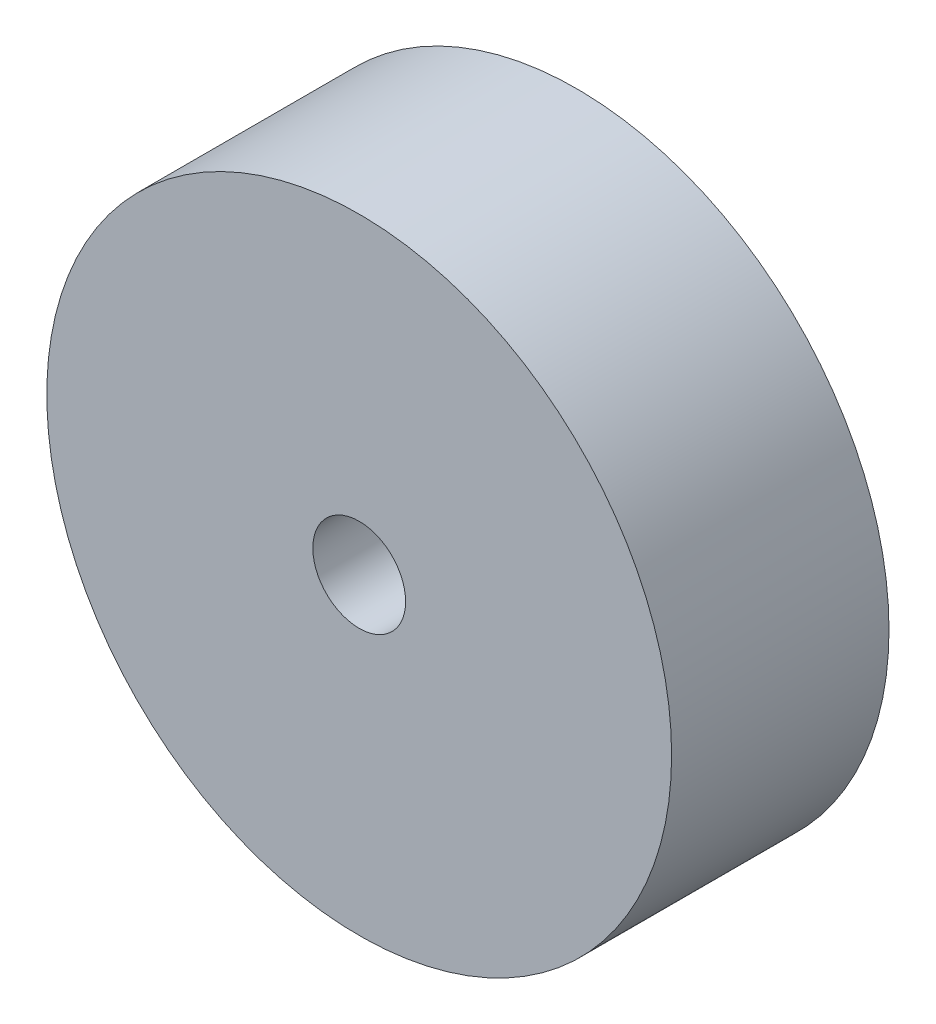
ISO-10303-21;
HEADER;
FILE_DESCRIPTION(('STEP AP214'),'2;1');
FILE_NAME('part.step','',(''),(''),'','','');
FILE_SCHEMA(('AUTOMOTIVE_DESIGN { 1 0 10303 214 1 1 1 1 }'));
ENDSEC;
DATA;
#1=APPLICATION_CONTEXT('core data for automotive mechanical design processes');
#2=APPLICATION_PROTOCOL_DEFINITION('international standard','automotive_design',2000,#1);
#3=PRODUCT_CONTEXT('',#1,'mechanical');
#4=PRODUCT('Part','Part','',(#3));
#5=PRODUCT_RELATED_PRODUCT_CATEGORY('part','',(#4));
#6=PRODUCT_DEFINITION_FORMATION('','',#4);
#7=PRODUCT_DEFINITION_CONTEXT('part definition',#1,'design');
#8=PRODUCT_DEFINITION('design','',#6,#7);
#9=PRODUCT_DEFINITION_SHAPE('','',#8);
#10=(LENGTH_UNIT() NAMED_UNIT(*) SI_UNIT(.MILLI.,.METRE.));
#11=(NAMED_UNIT(*) PLANE_ANGLE_UNIT() SI_UNIT($,.RADIAN.));
#12=(NAMED_UNIT(*) SI_UNIT($,.STERADIAN.) SOLID_ANGLE_UNIT());
#13=UNCERTAINTY_MEASURE_WITH_UNIT(LENGTH_MEASURE(1.E-05),#10,'distance_accuracy_value','');
#14=(GEOMETRIC_REPRESENTATION_CONTEXT(3) GLOBAL_UNCERTAINTY_ASSIGNED_CONTEXT((#13)) GLOBAL_UNIT_ASSIGNED_CONTEXT((#10,
#11,#12)) REPRESENTATION_CONTEXT('',''));
#15=CARTESIAN_POINT('',(0.,0.,0.));
#16=DIRECTION('',(0.,0.,1.));
#17=DIRECTION('',(1.,0.,0.));
#18=AXIS2_PLACEMENT_3D('',#15,#16,#17);
#19=CARTESIAN_POINT('',(0.,0.,9.49));
#20=DIRECTION('',(0.,0.,-1.));
#21=DIRECTION('',(-1.,0.,0.));
#22=AXIS2_PLACEMENT_3D('',#19,#20,#21);
#23=CYLINDRICAL_SURFACE('',#22,27.275);
#24=CARTESIAN_POINT('',(0.,0.,9.49));
#25=DIRECTION('',(0.,0.,1.));
#26=DIRECTION('',(1.,0.,0.));
#27=AXIS2_PLACEMENT_3D('',#24,#25,#26);
#28=CIRCLE('',#27,27.275);
#29=CARTESIAN_POINT('',(27.275,0.,9.49));
#30=VERTEX_POINT('',#29);
#31=EDGE_CURVE('E10',#30,#30,#28,.T.);
#32=ORIENTED_EDGE('',*,*,#31,.F.);
#33=EDGE_LOOP('',(#32));
#34=FACE_BOUND('',#33,.T.);
#35=CARTESIAN_POINT('',(0.,0.,-9.49));
#36=DIRECTION('',(0.,0.,1.));
#37=DIRECTION('',(1.,0.,0.));
#38=AXIS2_PLACEMENT_3D('',#35,#36,#37);
#39=CIRCLE('',#38,27.275);
#40=CARTESIAN_POINT('',(27.275,0.,-9.49));
#41=VERTEX_POINT('',#40);
#42=EDGE_CURVE('E34',#41,#41,#39,.T.);
#43=ORIENTED_EDGE('',*,*,#42,.T.);
#44=EDGE_LOOP('',(#43));
#45=FACE_BOUND('',#44,.T.);
#46=ADVANCED_FACE('F31',(#34,#45),#23,.T.);
#47=CARTESIAN_POINT('',(0.,0.,9.49));
#48=DIRECTION('',(0.,0.,1.));
#49=DIRECTION('',(1.,0.,0.));
#50=AXIS2_PLACEMENT_3D('',#47,#48,#49);
#51=PLANE('',#50);
#52=CARTESIAN_POINT('',(0.,0.,9.49));
#53=DIRECTION('',(0.,0.,1.));
#54=DIRECTION('',(1.,0.,0.));
#55=AXIS2_PLACEMENT_3D('',#52,#53,#54);
#56=CIRCLE('',#55,4.05);
#57=CARTESIAN_POINT('',(4.05,0.,9.49));
#58=VERTEX_POINT('',#57);
#59=EDGE_CURVE('E41',#58,#58,#56,.T.);
#60=ORIENTED_EDGE('',*,*,#59,.F.);
#61=EDGE_LOOP('',(#60));
#62=FACE_BOUND('',#61,.T.);
#63=ORIENTED_EDGE('',*,*,#31,.T.);
#64=EDGE_LOOP('',(#63));
#65=FACE_BOUND('',#64,.T.);
#66=ADVANCED_FACE('F54',(#62,#65),#51,.T.);
#67=CARTESIAN_POINT('',(0.,0.,-9.49));
#68=DIRECTION('',(0.,0.,1.));
#69=DIRECTION('',(1.,0.,0.));
#70=AXIS2_PLACEMENT_3D('',#67,#68,#69);
#71=PLANE('',#70);
#72=CARTESIAN_POINT('',(0.,0.,-9.49));
#73=DIRECTION('',(0.,0.,-1.));
#74=DIRECTION('',(-1.,0.,0.));
#75=AXIS2_PLACEMENT_3D('',#72,#73,#74);
#76=CIRCLE('',#75,4.05);
#77=CARTESIAN_POINT('',(-4.05,0.,-9.49));
#78=VERTEX_POINT('',#77);
#79=EDGE_CURVE('E45',#78,#78,#76,.T.);
#80=ORIENTED_EDGE('',*,*,#79,.F.);
#81=EDGE_LOOP('',(#80));
#82=FACE_BOUND('',#81,.T.);
#83=ORIENTED_EDGE('',*,*,#42,.F.);
#84=EDGE_LOOP('',(#83));
#85=FACE_BOUND('',#84,.T.);
#86=ADVANCED_FACE('F51',(#82,#85),#71,.F.);
#87=CARTESIAN_POINT('',(0.,0.,56.51));
#88=DIRECTION('',(0.,0.,-1.));
#89=DIRECTION('',(-1.,0.,0.));
#90=AXIS2_PLACEMENT_3D('',#87,#88,#89);
#91=CYLINDRICAL_SURFACE('',#90,4.05);
#92=ORIENTED_EDGE('',*,*,#59,.T.);
#93=EDGE_LOOP('',(#92));
#94=FACE_BOUND('',#93,.T.);
#95=ORIENTED_EDGE('',*,*,#79,.T.);
#96=EDGE_LOOP('',(#95));
#97=FACE_BOUND('',#96,.T.);
#98=ADVANCED_FACE('F49',(#94,#97),#91,.F.);
#99=CLOSED_SHELL('',(#46,#66,#86,#98));
#100=MANIFOLD_SOLID_BREP('B2',#99);
#101=ADVANCED_BREP_SHAPE_REPRESENTATION('',(#18,#100),#14);
#102=SHAPE_DEFINITION_REPRESENTATION(#9,#101);
ENDSEC;
END-ISO-10303-21;
